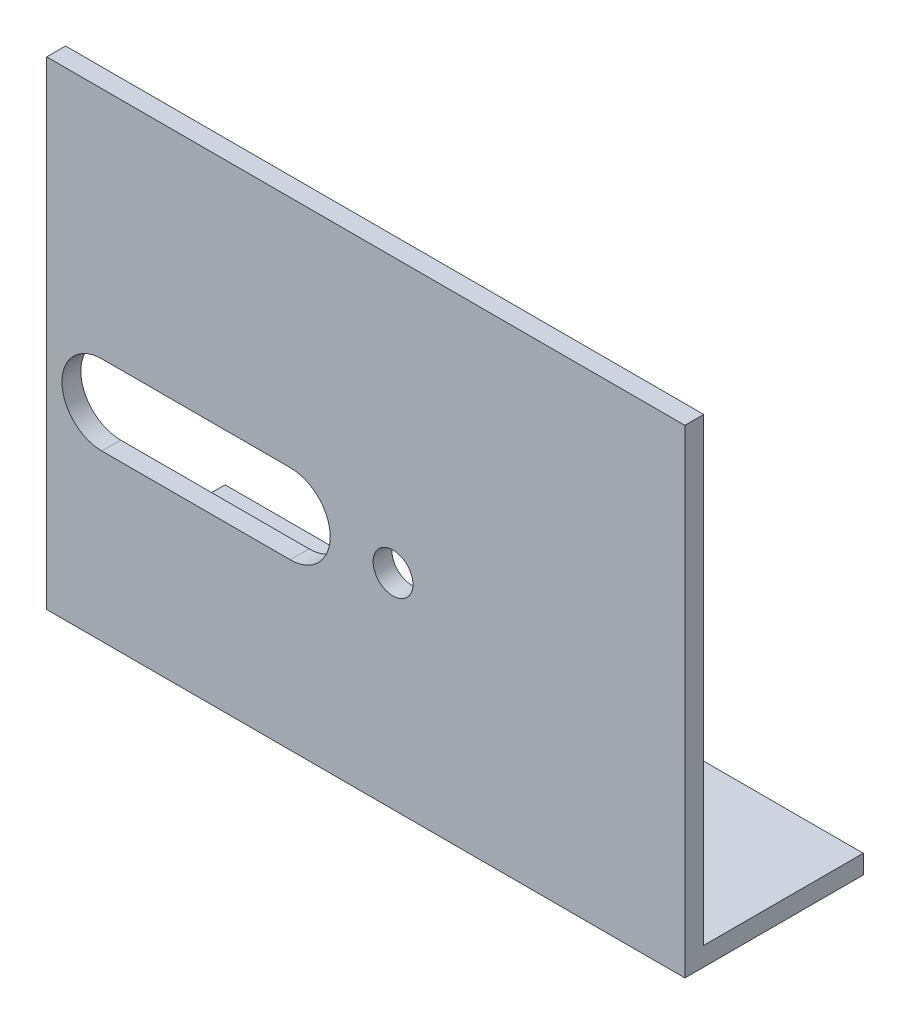
ISO-10303-21;
HEADER;
FILE_DESCRIPTION(('STEP AP214'),'2;1');
FILE_NAME('part.step','',(''),(''),'','','');
FILE_SCHEMA(('AUTOMOTIVE_DESIGN { 1 0 10303 214 1 1 1 1 }'));
ENDSEC;
DATA;
#1=APPLICATION_CONTEXT('core data for automotive mechanical design processes');
#2=APPLICATION_PROTOCOL_DEFINITION('international standard','automotive_design',2000,#1);
#3=PRODUCT_CONTEXT('',#1,'mechanical');
#4=PRODUCT('Part','Part','',(#3));
#5=PRODUCT_RELATED_PRODUCT_CATEGORY('part','',(#4));
#6=PRODUCT_DEFINITION_FORMATION('','',#4);
#7=PRODUCT_DEFINITION_CONTEXT('part definition',#1,'design');
#8=PRODUCT_DEFINITION('design','',#6,#7);
#9=PRODUCT_DEFINITION_SHAPE('','',#8);
#10=(LENGTH_UNIT() NAMED_UNIT(*) SI_UNIT(.MILLI.,.METRE.));
#11=(NAMED_UNIT(*) PLANE_ANGLE_UNIT() SI_UNIT($,.RADIAN.));
#12=(NAMED_UNIT(*) SI_UNIT($,.STERADIAN.) SOLID_ANGLE_UNIT());
#13=UNCERTAINTY_MEASURE_WITH_UNIT(LENGTH_MEASURE(1.E-05),#10,'distance_accuracy_value','');
#14=(GEOMETRIC_REPRESENTATION_CONTEXT(3) GLOBAL_UNCERTAINTY_ASSIGNED_CONTEXT((#13)) GLOBAL_UNIT_ASSIGNED_CONTEXT((#10,
#11,#12)) REPRESENTATION_CONTEXT('',''));
#15=CARTESIAN_POINT('',(0.,0.,0.));
#16=DIRECTION('',(0.,0.,1.));
#17=DIRECTION('',(1.,0.,0.));
#18=AXIS2_PLACEMENT_3D('',#15,#16,#17);
#19=CARTESIAN_POINT('',(0.,0.,0.));
#20=DIRECTION('',(0.,0.,1.));
#21=DIRECTION('',(1.,0.,0.));
#22=AXIS2_PLACEMENT_3D('',#19,#20,#21);
#23=PLANE('',#22);
#24=CARTESIAN_POINT('',(4.33,-5.5,0.));
#25=DIRECTION('',(0.,0.,1.));
#26=DIRECTION('',(1.,0.,0.));
#27=AXIS2_PLACEMENT_3D('',#24,#25,#26);
#28=CIRCLE('',#27,3.175);
#29=CARTESIAN_POINT('',(7.505,-5.5,0.));
#30=VERTEX_POINT('',#29);
#31=EDGE_CURVE('E337',#30,#30,#28,.T.);
#32=ORIENTED_EDGE('',*,*,#31,.T.);
#33=EDGE_LOOP('',(#32));
#34=FACE_BOUND('',#33,.T.);
#35=DIRECTION('',(-1.,0.,0.));
#36=VECTOR('',#35,1.);
#37=CARTESIAN_POINT('',(0.,0.85,0.));
#38=LINE('',#37,#36);
#39=CARTESIAN_POINT('',(-12.02,0.850000000000001,0.));
#40=VERTEX_POINT('',#39);
#41=CARTESIAN_POINT('',(-42.02,0.850000000000003,0.));
#42=VERTEX_POINT('',#41);
#43=EDGE_CURVE('E139',#40,#42,#38,.T.);
#44=ORIENTED_EDGE('',*,*,#43,.T.);
#45=CARTESIAN_POINT('',(-42.02,-5.5,0.));
#46=DIRECTION('',(0.,0.,1.));
#47=DIRECTION('',(1.,0.,0.));
#48=AXIS2_PLACEMENT_3D('',#45,#46,#47);
#49=CIRCLE('',#48,6.35);
#50=CARTESIAN_POINT('',(-42.02,-11.85,0.));
#51=VERTEX_POINT('',#50);
#52=EDGE_CURVE('E142',#42,#51,#49,.T.);
#53=ORIENTED_EDGE('',*,*,#52,.T.);
#54=DIRECTION('',(1.,0.,0.));
#55=VECTOR('',#54,1.);
#56=CARTESIAN_POINT('',(0.,-11.85,0.));
#57=LINE('',#56,#55);
#58=CARTESIAN_POINT('',(-12.02,-11.85,0.));
#59=VERTEX_POINT('',#58);
#60=EDGE_CURVE('E134',#51,#59,#57,.T.);
#61=ORIENTED_EDGE('',*,*,#60,.T.);
#62=CARTESIAN_POINT('',(-12.02,-5.5,0.));
#63=DIRECTION('',(0.,0.,1.));
#64=DIRECTION('',(1.,0.,0.));
#65=AXIS2_PLACEMENT_3D('',#62,#63,#64);
#66=CIRCLE('',#65,6.35);
#67=EDGE_CURVE('E114',#59,#40,#66,.T.);
#68=ORIENTED_EDGE('',*,*,#67,.T.);
#69=EDGE_LOOP('',(#44,#53,#61,#68));
#70=FACE_BOUND('',#69,.T.);
#71=DIRECTION('',(1.,0.,0.));
#72=VECTOR('',#71,1.);
#73=CARTESIAN_POINT('',(50.8,-35.1,0.));
#74=LINE('',#73,#72);
#75=CARTESIAN_POINT('',(-50.8,-35.1,0.));
#76=VERTEX_POINT('',#75);
#77=CARTESIAN_POINT('',(50.8,-35.1,0.));
#78=VERTEX_POINT('',#77);
#79=EDGE_CURVE('E145',#76,#78,#74,.T.);
#80=ORIENTED_EDGE('',*,*,#79,.F.);
#81=DIRECTION('',(0.,-1.,0.));
#82=VECTOR('',#81,1.);
#83=CARTESIAN_POINT('',(-50.8,-38.1,0.));
#84=LINE('',#83,#82);
#85=CARTESIAN_POINT('',(-50.8,38.1,0.));
#86=VERTEX_POINT('',#85);
#87=EDGE_CURVE('E164',#86,#76,#84,.T.);
#88=ORIENTED_EDGE('',*,*,#87,.F.);
#89=DIRECTION('',(-1.,0.,0.));
#90=VECTOR('',#89,1.);
#91=CARTESIAN_POINT('',(50.8,38.1,0.));
#92=LINE('',#91,#90);
#93=CARTESIAN_POINT('',(50.8,38.1,0.));
#94=VERTEX_POINT('',#93);
#95=EDGE_CURVE('E169',#94,#86,#92,.T.);
#96=ORIENTED_EDGE('',*,*,#95,.F.);
#97=DIRECTION('',(0.,1.,0.));
#98=VECTOR('',#97,1.);
#99=CARTESIAN_POINT('',(50.8,-38.1,0.));
#100=LINE('',#99,#98);
#101=EDGE_CURVE('E178',#78,#94,#100,.T.);
#102=ORIENTED_EDGE('',*,*,#101,.F.);
#103=EDGE_LOOP('',(#80,#88,#96,#102));
#104=FACE_BOUND('',#103,.T.);
#105=ADVANCED_FACE('F32',(#34,#70,#104),#23,.F.);
#106=CARTESIAN_POINT('',(-50.8,-38.1,3.));
#107=DIRECTION('',(1.,0.,0.));
#108=DIRECTION('',(0.,0.,-1.));
#109=AXIS2_PLACEMENT_3D('',#106,#107,#108);
#110=PLANE('',#109);
#111=ORIENTED_EDGE('',*,*,#87,.T.);
#112=DIRECTION('',(0.,0.,1.));
#113=VECTOR('',#112,1.);
#114=CARTESIAN_POINT('',(-50.8,-35.1,-25.4));
#115=LINE('',#114,#113);
#116=CARTESIAN_POINT('',(-50.8,-35.1,-25.4));
#117=VERTEX_POINT('',#116);
#118=EDGE_CURVE('E161',#117,#76,#115,.T.);
#119=ORIENTED_EDGE('',*,*,#118,.F.);
#120=DIRECTION('',(0.,1.,0.));
#121=VECTOR('',#120,1.);
#122=CARTESIAN_POINT('',(-50.8,-38.1,-25.4));
#123=LINE('',#122,#121);
#124=CARTESIAN_POINT('',(-50.8,-38.1,-25.4));
#125=VERTEX_POINT('',#124);
#126=EDGE_CURVE('E152',#125,#117,#123,.T.);
#127=ORIENTED_EDGE('',*,*,#126,.F.);
#128=DIRECTION('',(0.,0.,-1.));
#129=VECTOR('',#128,1.);
#130=CARTESIAN_POINT('',(-50.8,-38.1,3.));
#131=LINE('',#130,#129);
#132=CARTESIAN_POINT('',(-50.8,-38.1,3.));
#133=VERTEX_POINT('',#132);
#134=EDGE_CURVE('E11',#133,#125,#131,.T.);
#135=ORIENTED_EDGE('',*,*,#134,.F.);
#136=DIRECTION('',(0.,-1.,0.));
#137=VECTOR('',#136,1.);
#138=CARTESIAN_POINT('',(-50.8,-38.1,3.));
#139=LINE('',#138,#137);
#140=CARTESIAN_POINT('',(-50.8,38.1,3.));
#141=VERTEX_POINT('',#140);
#142=EDGE_CURVE('E165',#141,#133,#139,.T.);
#143=ORIENTED_EDGE('',*,*,#142,.F.);
#144=DIRECTION('',(0.,0.,-1.));
#145=VECTOR('',#144,1.);
#146=CARTESIAN_POINT('',(-50.8,38.1,3.));
#147=LINE('',#146,#145);
#148=EDGE_CURVE('E175',#141,#86,#147,.T.);
#149=ORIENTED_EDGE('',*,*,#148,.T.);
#150=EDGE_LOOP('',(#111,#119,#127,#135,#143,#149));
#151=FACE_BOUND('',#150,.T.);
#152=ADVANCED_FACE('F34',(#151),#110,.F.);
#153=CARTESIAN_POINT('',(50.8,-38.1,3.));
#154=DIRECTION('',(0.,1.,0.));
#155=DIRECTION('',(-1.,0.,0.));
#156=AXIS2_PLACEMENT_3D('',#153,#154,#155);
#157=PLANE('',#156);
#158=ORIENTED_EDGE('',*,*,#134,.T.);
#159=DIRECTION('',(-1.,0.,0.));
#160=VECTOR('',#159,1.);
#161=CARTESIAN_POINT('',(50.8,-38.1,-25.4));
#162=LINE('',#161,#160);
#163=CARTESIAN_POINT('',(50.8,-38.1,-25.4));
#164=VERTEX_POINT('',#163);
#165=EDGE_CURVE('E149',#164,#125,#162,.T.);
#166=ORIENTED_EDGE('',*,*,#165,.F.);
#167=DIRECTION('',(0.,0.,-1.));
#168=VECTOR('',#167,1.);
#169=CARTESIAN_POINT('',(50.8,-38.1,3.));
#170=LINE('',#169,#168);
#171=CARTESIAN_POINT('',(50.8,-38.1,3.));
#172=VERTEX_POINT('',#171);
#173=EDGE_CURVE('E40',#172,#164,#170,.T.);
#174=ORIENTED_EDGE('',*,*,#173,.F.);
#175=DIRECTION('',(1.,0.,0.));
#176=VECTOR('',#175,1.);
#177=CARTESIAN_POINT('',(50.8,-38.1,3.));
#178=LINE('',#177,#176);
#179=EDGE_CURVE('E168',#133,#172,#178,.T.);
#180=ORIENTED_EDGE('',*,*,#179,.F.);
#181=EDGE_LOOP('',(#158,#166,#174,#180));
#182=FACE_BOUND('',#181,.T.);
#183=ADVANCED_FACE('F193',(#182),#157,.F.);
#184=CARTESIAN_POINT('',(50.8,-38.1,3.));
#185=DIRECTION('',(-1.,0.,0.));
#186=DIRECTION('',(0.,0.,1.));
#187=AXIS2_PLACEMENT_3D('',#184,#185,#186);
#188=PLANE('',#187);
#189=ORIENTED_EDGE('',*,*,#173,.T.);
#190=DIRECTION('',(0.,-1.,0.));
#191=VECTOR('',#190,1.);
#192=CARTESIAN_POINT('',(50.8,-38.1,-25.4));
#193=LINE('',#192,#191);
#194=CARTESIAN_POINT('',(50.8,-35.1,-25.4));
#195=VERTEX_POINT('',#194);
#196=EDGE_CURVE('E146',#195,#164,#193,.T.);
#197=ORIENTED_EDGE('',*,*,#196,.F.);
#198=DIRECTION('',(0.,0.,1.));
#199=VECTOR('',#198,1.);
#200=CARTESIAN_POINT('',(50.8,-35.1,-25.4));
#201=LINE('',#200,#199);
#202=EDGE_CURVE('E156',#195,#78,#201,.T.);
#203=ORIENTED_EDGE('',*,*,#202,.T.);
#204=ORIENTED_EDGE('',*,*,#101,.T.);
#205=DIRECTION('',(0.,0.,-1.));
#206=VECTOR('',#205,1.);
#207=CARTESIAN_POINT('',(50.8,38.1,3.));
#208=LINE('',#207,#206);
#209=CARTESIAN_POINT('',(50.8,38.1,3.));
#210=VERTEX_POINT('',#209);
#211=EDGE_CURVE('E183',#210,#94,#208,.T.);
#212=ORIENTED_EDGE('',*,*,#211,.F.);
#213=DIRECTION('',(0.,1.,0.));
#214=VECTOR('',#213,1.);
#215=CARTESIAN_POINT('',(50.8,-38.1,3.));
#216=LINE('',#215,#214);
#217=EDGE_CURVE('E171',#172,#210,#216,.T.);
#218=ORIENTED_EDGE('',*,*,#217,.F.);
#219=EDGE_LOOP('',(#189,#197,#203,#204,#212,#218));
#220=FACE_BOUND('',#219,.T.);
#221=ADVANCED_FACE('F190',(#220),#188,.F.);
#222=CARTESIAN_POINT('',(50.8,38.1,3.));
#223=DIRECTION('',(0.,-1.,0.));
#224=DIRECTION('',(1.,0.,0.));
#225=AXIS2_PLACEMENT_3D('',#222,#223,#224);
#226=PLANE('',#225);
#227=ORIENTED_EDGE('',*,*,#95,.T.);
#228=ORIENTED_EDGE('',*,*,#148,.F.);
#229=DIRECTION('',(-1.,0.,0.));
#230=VECTOR('',#229,1.);
#231=CARTESIAN_POINT('',(50.8,38.1,3.));
#232=LINE('',#231,#230);
#233=EDGE_CURVE('E173',#210,#141,#232,.T.);
#234=ORIENTED_EDGE('',*,*,#233,.F.);
#235=ORIENTED_EDGE('',*,*,#211,.T.);
#236=EDGE_LOOP('',(#227,#228,#234,#235));
#237=FACE_BOUND('',#236,.T.);
#238=ADVANCED_FACE('F207',(#237),#226,.F.);
#239=CARTESIAN_POINT('',(0.,0.,3.));
#240=DIRECTION('',(0.,0.,1.));
#241=DIRECTION('',(1.,0.,0.));
#242=AXIS2_PLACEMENT_3D('',#239,#240,#241);
#243=PLANE('',#242);
#244=CARTESIAN_POINT('',(4.33,-5.5,3.));
#245=DIRECTION('',(0.,0.,1.));
#246=DIRECTION('',(1.,0.,0.));
#247=AXIS2_PLACEMENT_3D('',#244,#245,#246);
#248=CIRCLE('',#247,3.175);
#249=CARTESIAN_POINT('',(7.505,-5.5,3.));
#250=VERTEX_POINT('',#249);
#251=EDGE_CURVE('E335',#250,#250,#248,.T.);
#252=ORIENTED_EDGE('',*,*,#251,.F.);
#253=EDGE_LOOP('',(#252));
#254=FACE_BOUND('',#253,.T.);
#255=CARTESIAN_POINT('',(-42.02,-5.5,3.));
#256=DIRECTION('',(0.,0.,1.));
#257=DIRECTION('',(1.,0.,0.));
#258=AXIS2_PLACEMENT_3D('',#255,#256,#257);
#259=CIRCLE('',#258,6.35);
#260=CARTESIAN_POINT('',(-42.02,0.850000000000003,3.));
#261=VERTEX_POINT('',#260);
#262=CARTESIAN_POINT('',(-42.02,-11.85,3.));
#263=VERTEX_POINT('',#262);
#264=EDGE_CURVE('E55',#261,#263,#259,.T.);
#265=ORIENTED_EDGE('',*,*,#264,.F.);
#266=DIRECTION('',(-1.,0.,0.));
#267=VECTOR('',#266,1.);
#268=CARTESIAN_POINT('',(-42.02,0.850000000000003,3.));
#269=LINE('',#268,#267);
#270=CARTESIAN_POINT('',(-12.02,0.850000000000001,3.));
#271=VERTEX_POINT('',#270);
#272=EDGE_CURVE('E127',#271,#261,#269,.T.);
#273=ORIENTED_EDGE('',*,*,#272,.F.);
#274=CARTESIAN_POINT('',(-12.02,-5.5,3.));
#275=DIRECTION('',(0.,0.,1.));
#276=DIRECTION('',(1.,0.,0.));
#277=AXIS2_PLACEMENT_3D('',#274,#275,#276);
#278=CIRCLE('',#277,6.35);
#279=CARTESIAN_POINT('',(-12.02,-11.85,3.));
#280=VERTEX_POINT('',#279);
#281=EDGE_CURVE('E111',#280,#271,#278,.T.);
#282=ORIENTED_EDGE('',*,*,#281,.F.);
#283=DIRECTION('',(1.,0.,0.));
#284=VECTOR('',#283,1.);
#285=CARTESIAN_POINT('',(-42.02,-11.85,3.));
#286=LINE('',#285,#284);
#287=EDGE_CURVE('E120',#263,#280,#286,.T.);
#288=ORIENTED_EDGE('',*,*,#287,.F.);
#289=EDGE_LOOP('',(#265,#273,#282,#288));
#290=FACE_BOUND('',#289,.T.);
#291=ORIENTED_EDGE('',*,*,#142,.T.);
#292=ORIENTED_EDGE('',*,*,#179,.T.);
#293=ORIENTED_EDGE('',*,*,#217,.T.);
#294=ORIENTED_EDGE('',*,*,#233,.T.);
#295=EDGE_LOOP('',(#291,#292,#293,#294));
#296=FACE_BOUND('',#295,.T.);
#297=ADVANCED_FACE('F124',(#254,#290,#296),#243,.T.);
#298=CARTESIAN_POINT('',(50.8,-35.1,-25.4));
#299=DIRECTION('',(0.,-1.,0.));
#300=DIRECTION('',(0.,0.,-1.));
#301=AXIS2_PLACEMENT_3D('',#298,#299,#300);
#302=PLANE('',#301);
#303=ORIENTED_EDGE('',*,*,#79,.T.);
#304=ORIENTED_EDGE('',*,*,#202,.F.);
#305=DIRECTION('',(1.,0.,0.));
#306=VECTOR('',#305,1.);
#307=CARTESIAN_POINT('',(50.8,-35.1,-25.4));
#308=LINE('',#307,#306);
#309=EDGE_CURVE('E154',#117,#195,#308,.T.);
#310=ORIENTED_EDGE('',*,*,#309,.F.);
#311=ORIENTED_EDGE('',*,*,#118,.T.);
#312=EDGE_LOOP('',(#303,#304,#310,#311));
#313=FACE_BOUND('',#312,.T.);
#314=ADVANCED_FACE('F202',(#313),#302,.F.);
#315=CARTESIAN_POINT('',(0.,0.,-25.4));
#316=DIRECTION('',(0.,0.,1.));
#317=DIRECTION('',(1.,0.,0.));
#318=AXIS2_PLACEMENT_3D('',#315,#316,#317);
#319=PLANE('',#318);
#320=ORIENTED_EDGE('',*,*,#196,.T.);
#321=ORIENTED_EDGE('',*,*,#165,.T.);
#322=ORIENTED_EDGE('',*,*,#126,.T.);
#323=ORIENTED_EDGE('',*,*,#309,.T.);
#324=EDGE_LOOP('',(#320,#321,#322,#323));
#325=FACE_BOUND('',#324,.T.);
#326=ADVANCED_FACE('F197',(#325),#319,.F.);
#327=CARTESIAN_POINT('',(-42.02,-5.5,-25.4));
#328=DIRECTION('',(0.,0.,1.));
#329=DIRECTION('',(1.,0.,0.));
#330=AXIS2_PLACEMENT_3D('',#327,#328,#329);
#331=CYLINDRICAL_SURFACE('',#330,6.35);
#332=DIRECTION('',(0.,0.,1.));
#333=VECTOR('',#332,1.);
#334=CARTESIAN_POINT('',(-42.02,0.850000000000003,-25.4));
#335=LINE('',#334,#333);
#336=EDGE_CURVE('E132',#42,#261,#335,.T.);
#337=ORIENTED_EDGE('',*,*,#336,.T.);
#338=ORIENTED_EDGE('',*,*,#264,.T.);
#339=DIRECTION('',(0.,0.,1.));
#340=VECTOR('',#339,1.);
#341=CARTESIAN_POINT('',(-42.02,-11.85,-25.4));
#342=LINE('',#341,#340);
#343=EDGE_CURVE('E117',#51,#263,#342,.T.);
#344=ORIENTED_EDGE('',*,*,#343,.F.);
#345=ORIENTED_EDGE('',*,*,#52,.F.);
#346=EDGE_LOOP('',(#337,#338,#344,#345));
#347=FACE_BOUND('',#346,.T.);
#348=ADVANCED_FACE('F261',(#347),#331,.F.);
#349=CARTESIAN_POINT('',(-42.02,0.850000000000003,-25.4));
#350=DIRECTION('',(0.,1.,0.));
#351=DIRECTION('',(-1.,0.,0.));
#352=AXIS2_PLACEMENT_3D('',#349,#350,#351);
#353=PLANE('',#352);
#354=DIRECTION('',(0.,0.,1.));
#355=VECTOR('',#354,1.);
#356=CARTESIAN_POINT('',(-12.02,0.850000000000001,-25.4));
#357=LINE('',#356,#355);
#358=EDGE_CURVE('E116',#40,#271,#357,.T.);
#359=ORIENTED_EDGE('',*,*,#358,.T.);
#360=ORIENTED_EDGE('',*,*,#272,.T.);
#361=ORIENTED_EDGE('',*,*,#336,.F.);
#362=ORIENTED_EDGE('',*,*,#43,.F.);
#363=EDGE_LOOP('',(#359,#360,#361,#362));
#364=FACE_BOUND('',#363,.T.);
#365=ADVANCED_FACE('F267',(#364),#353,.F.);
#366=CARTESIAN_POINT('',(-12.02,-5.5,-25.4));
#367=DIRECTION('',(0.,0.,1.));
#368=DIRECTION('',(1.,0.,0.));
#369=AXIS2_PLACEMENT_3D('',#366,#367,#368);
#370=CYLINDRICAL_SURFACE('',#369,6.35);
#371=DIRECTION('',(0.,0.,1.));
#372=VECTOR('',#371,1.);
#373=CARTESIAN_POINT('',(-12.02,-11.85,-25.4));
#374=LINE('',#373,#372);
#375=EDGE_CURVE('E47',#59,#280,#374,.T.);
#376=ORIENTED_EDGE('',*,*,#375,.T.);
#377=ORIENTED_EDGE('',*,*,#281,.T.);
#378=ORIENTED_EDGE('',*,*,#358,.F.);
#379=ORIENTED_EDGE('',*,*,#67,.F.);
#380=EDGE_LOOP('',(#376,#377,#378,#379));
#381=FACE_BOUND('',#380,.T.);
#382=ADVANCED_FACE('F108',(#381),#370,.F.);
#383=CARTESIAN_POINT('',(-42.02,-11.85,-25.4));
#384=DIRECTION('',(0.,-1.,0.));
#385=DIRECTION('',(1.,0.,0.));
#386=AXIS2_PLACEMENT_3D('',#383,#384,#385);
#387=PLANE('',#386);
#388=ORIENTED_EDGE('',*,*,#343,.T.);
#389=ORIENTED_EDGE('',*,*,#287,.T.);
#390=ORIENTED_EDGE('',*,*,#375,.F.);
#391=ORIENTED_EDGE('',*,*,#60,.F.);
#392=EDGE_LOOP('',(#388,#389,#390,#391));
#393=FACE_BOUND('',#392,.T.);
#394=ADVANCED_FACE('F121',(#393),#387,.F.);
#395=CARTESIAN_POINT('',(4.33,-5.5,-25.4));
#396=DIRECTION('',(0.,0.,1.));
#397=DIRECTION('',(1.,0.,0.));
#398=AXIS2_PLACEMENT_3D('',#395,#396,#397);
#399=CYLINDRICAL_SURFACE('',#398,3.175);
#400=ORIENTED_EDGE('',*,*,#251,.T.);
#401=EDGE_LOOP('',(#400));
#402=FACE_BOUND('',#401,.T.);
#403=ORIENTED_EDGE('',*,*,#31,.F.);
#404=EDGE_LOOP('',(#403));
#405=FACE_BOUND('',#404,.T.);
#406=ADVANCED_FACE('F287',(#402,#405),#399,.F.);
#407=CLOSED_SHELL('',(#105,#152,#183,#221,#238,#297,#314,#326,#348,#365,#382,#394,#406));
#408=MANIFOLD_SOLID_BREP('B2',#407);
#409=ADVANCED_BREP_SHAPE_REPRESENTATION('',(#18,#408),#14);
#410=SHAPE_DEFINITION_REPRESENTATION(#9,#409);
ENDSEC;
END-ISO-10303-21;
